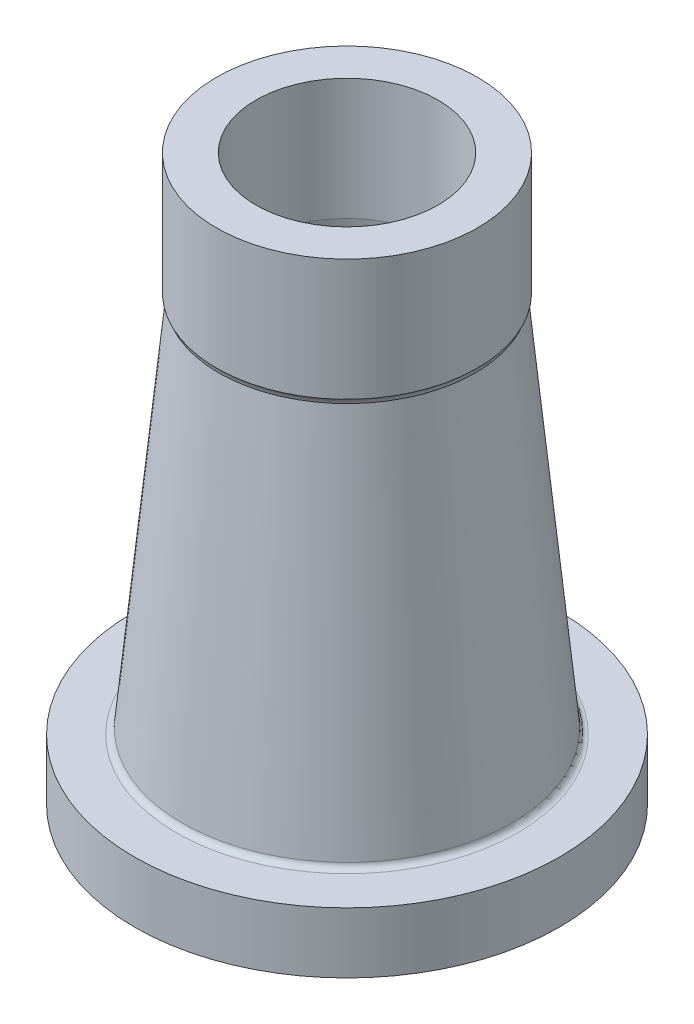
ISO-10303-21;
HEADER;
FILE_DESCRIPTION(('STEP AP214'),'2;1');
FILE_NAME('part.step','',(''),(''),'','','');
FILE_SCHEMA(('AUTOMOTIVE_DESIGN { 1 0 10303 214 1 1 1 1 }'));
ENDSEC;
DATA;
#1=APPLICATION_CONTEXT('core data for automotive mechanical design processes');
#2=APPLICATION_PROTOCOL_DEFINITION('international standard','automotive_design',2000,#1);
#3=PRODUCT_CONTEXT('',#1,'mechanical');
#4=PRODUCT('Part','Part','',(#3));
#5=PRODUCT_RELATED_PRODUCT_CATEGORY('part','',(#4));
#6=PRODUCT_DEFINITION_FORMATION('','',#4);
#7=PRODUCT_DEFINITION_CONTEXT('part definition',#1,'design');
#8=PRODUCT_DEFINITION('design','',#6,#7);
#9=PRODUCT_DEFINITION_SHAPE('','',#8);
#10=(LENGTH_UNIT() NAMED_UNIT(*) SI_UNIT(.MILLI.,.METRE.));
#11=(NAMED_UNIT(*) PLANE_ANGLE_UNIT() SI_UNIT($,.RADIAN.));
#12=(NAMED_UNIT(*) SI_UNIT($,.STERADIAN.) SOLID_ANGLE_UNIT());
#13=UNCERTAINTY_MEASURE_WITH_UNIT(LENGTH_MEASURE(1.E-05),#10,'distance_accuracy_value','');
#14=(GEOMETRIC_REPRESENTATION_CONTEXT(3) GLOBAL_UNCERTAINTY_ASSIGNED_CONTEXT((#13)) GLOBAL_UNIT_ASSIGNED_CONTEXT((#10,
#11,#12)) REPRESENTATION_CONTEXT('',''));
#15=CARTESIAN_POINT('',(0.,0.,0.));
#16=DIRECTION('',(0.,0.,1.));
#17=DIRECTION('',(1.,0.,0.));
#18=AXIS2_PLACEMENT_3D('',#15,#16,#17);
#19=CARTESIAN_POINT('',(0.,0.,0.));
#20=DIRECTION('',(0.,-1.,0.));
#21=DIRECTION('',(0.,0.,-1.));
#22=AXIS2_PLACEMENT_3D('',#19,#20,#21);
#23=CYLINDRICAL_SURFACE('',#22,30.);
#24=CARTESIAN_POINT('',(0.,146.,0.));
#25=DIRECTION('',(0.,-1.,0.));
#26=DIRECTION('',(0.,0.,-1.));
#27=AXIS2_PLACEMENT_3D('',#24,#25,#26);
#28=CIRCLE('',#27,30.);
#29=CARTESIAN_POINT('',(0.,146.,-30.));
#30=VERTEX_POINT('',#29);
#31=EDGE_CURVE('E10',#30,#30,#28,.T.);
#32=ORIENTED_EDGE('',*,*,#31,.T.);
#33=EDGE_LOOP('',(#32));
#34=FACE_BOUND('',#33,.T.);
#35=CARTESIAN_POINT('',(0.,186.,0.));
#36=DIRECTION('',(0.,-1.,0.));
#37=DIRECTION('',(0.,0.,-1.));
#38=AXIS2_PLACEMENT_3D('',#35,#36,#37);
#39=CIRCLE('',#38,30.);
#40=CARTESIAN_POINT('',(0.,186.,-30.));
#41=VERTEX_POINT('',#40);
#42=EDGE_CURVE('E78',#41,#41,#39,.T.);
#43=ORIENTED_EDGE('',*,*,#42,.F.);
#44=EDGE_LOOP('',(#43));
#45=FACE_BOUND('',#44,.T.);
#46=ADVANCED_FACE('F35',(#34,#45),#23,.F.);
#47=CARTESIAN_POINT('',(0.,146.,0.));
#48=DIRECTION('',(0.,-1.,0.));
#49=DIRECTION('',(0.,0.,-1.));
#50=AXIS2_PLACEMENT_3D('',#47,#48,#49);
#51=CONICAL_SURFACE('',#50,30.,0.0975910931533878);
#52=CARTESIAN_POINT('',(0.,3.,0.));
#53=DIRECTION('',(0.,-1.,0.));
#54=DIRECTION('',(0.,0.,-1.));
#55=AXIS2_PLACEMENT_3D('',#52,#53,#54);
#56=CIRCLE('',#55,44.);
#57=CARTESIAN_POINT('',(0.,3.,-44.));
#58=VERTEX_POINT('',#57);
#59=EDGE_CURVE('E41',#58,#58,#56,.T.);
#60=ORIENTED_EDGE('',*,*,#59,.T.);
#61=EDGE_LOOP('',(#60));
#62=FACE_BOUND('',#61,.T.);
#63=ORIENTED_EDGE('',*,*,#31,.F.);
#64=EDGE_LOOP('',(#63));
#65=FACE_BOUND('',#64,.T.);
#66=ADVANCED_FACE('F86',(#62,#65),#51,.F.);
#67=CARTESIAN_POINT('',(47.8925359391083,3.,0.));
#68=DIRECTION('',(0.,-1.,0.));
#69=DIRECTION('',(0.,0.,-1.));
#70=AXIS2_PLACEMENT_3D('',#67,#68,#69);
#71=PLANE('',#70);
#72=CARTESIAN_POINT('',(0.,3.,0.));
#73=DIRECTION('',(0.,-1.,0.));
#74=DIRECTION('',(0.,0.,-1.));
#75=AXIS2_PLACEMENT_3D('',#72,#73,#74);
#76=CIRCLE('',#75,47.8925359391083);
#77=CARTESIAN_POINT('',(0.,3.,-47.8925359391083));
#78=VERTEX_POINT('',#77);
#79=EDGE_CURVE('E45',#78,#78,#76,.T.);
#80=ORIENTED_EDGE('',*,*,#79,.T.);
#81=EDGE_LOOP('',(#80));
#82=FACE_BOUND('',#81,.T.);
#83=ORIENTED_EDGE('',*,*,#59,.F.);
#84=EDGE_LOOP('',(#83));
#85=FACE_BOUND('',#84,.T.);
#86=ADVANCED_FACE('F90',(#82,#85),#71,.T.);
#87=CARTESIAN_POINT('',(0.,0.999999999999998,0.));
#88=DIRECTION('',(0.,-1.,0.));
#89=DIRECTION('',(0.,0.,-1.));
#90=AXIS2_PLACEMENT_3D('',#87,#88,#89);
#91=TOROIDAL_SURFACE('',#90,47.8925359391083,2.);
#92=CARTESIAN_POINT('',(0.,1.19487251392129,0.));
#93=DIRECTION('',(0.,-1.,0.));
#94=DIRECTION('',(0.,0.,-1.));
#95=AXIS2_PLACEMENT_3D('',#92,#93,#94);
#96=CIRCLE('',#95,49.8830194741616);
#97=CARTESIAN_POINT('',(0.,1.19487251392129,-49.8830194741616));
#98=VERTEX_POINT('',#97);
#99=EDGE_CURVE('E49',#98,#98,#96,.T.);
#100=ORIENTED_EDGE('',*,*,#99,.T.);
#101=EDGE_LOOP('',(#100));
#102=FACE_BOUND('',#101,.T.);
#103=ORIENTED_EDGE('',*,*,#79,.F.);
#104=EDGE_LOOP('',(#103));
#105=FACE_BOUND('',#104,.T.);
#106=ADVANCED_FACE('F94',(#102,#105),#91,.F.);
#107=CARTESIAN_POINT('',(0.,1.19487251392129,0.));
#108=DIRECTION('',(0.,-1.,0.));
#109=DIRECTION('',(0.,0.,-1.));
#110=AXIS2_PLACEMENT_3D('',#107,#108,#109);
#111=CONICAL_SURFACE('',#110,49.8830194741616,0.0975910931533844);
#112=CARTESIAN_POINT('',(0.,0.,0.));
#113=DIRECTION('',(0.,-1.,0.));
#114=DIRECTION('',(0.,0.,-1.));
#115=AXIS2_PLACEMENT_3D('',#112,#113,#114);
#116=CIRCLE('',#115,50.);
#117=CARTESIAN_POINT('',(0.,0.,-50.));
#118=VERTEX_POINT('',#117);
#119=EDGE_CURVE('E54',#118,#118,#116,.T.);
#120=ORIENTED_EDGE('',*,*,#119,.T.);
#121=EDGE_LOOP('',(#120));
#122=FACE_BOUND('',#121,.T.);
#123=ORIENTED_EDGE('',*,*,#99,.F.);
#124=EDGE_LOOP('',(#123));
#125=FACE_BOUND('',#124,.T.);
#126=ADVANCED_FACE('F101',(#122,#125),#111,.F.);
#127=CARTESIAN_POINT('',(70.,0.,0.));
#128=DIRECTION('',(0.,-1.,0.));
#129=DIRECTION('',(0.,0.,-1.));
#130=AXIS2_PLACEMENT_3D('',#127,#128,#129);
#131=PLANE('',#130);
#132=CARTESIAN_POINT('',(0.,0.,0.));
#133=DIRECTION('',(0.,-1.,0.));
#134=DIRECTION('',(0.,0.,-1.));
#135=AXIS2_PLACEMENT_3D('',#132,#133,#134);
#136=CIRCLE('',#135,70.);
#137=CARTESIAN_POINT('',(0.,0.,-70.));
#138=VERTEX_POINT('',#137);
#139=EDGE_CURVE('E57',#138,#138,#136,.T.);
#140=ORIENTED_EDGE('',*,*,#139,.T.);
#141=EDGE_LOOP('',(#140));
#142=FACE_BOUND('',#141,.T.);
#143=ORIENTED_EDGE('',*,*,#119,.F.);
#144=EDGE_LOOP('',(#143));
#145=FACE_BOUND('',#144,.T.);
#146=ADVANCED_FACE('F105',(#142,#145),#131,.T.);
#147=CARTESIAN_POINT('',(0.,0.,0.));
#148=DIRECTION('',(0.,-1.,0.));
#149=DIRECTION('',(0.,0.,-1.));
#150=AXIS2_PLACEMENT_3D('',#147,#148,#149);
#151=CYLINDRICAL_SURFACE('',#150,70.);
#152=CARTESIAN_POINT('',(0.,20.,0.));
#153=DIRECTION('',(0.,-1.,0.));
#154=DIRECTION('',(0.,0.,-1.));
#155=AXIS2_PLACEMENT_3D('',#152,#153,#154);
#156=CIRCLE('',#155,70.);
#157=CARTESIAN_POINT('',(0.,20.,-70.));
#158=VERTEX_POINT('',#157);
#159=EDGE_CURVE('E60',#158,#158,#156,.T.);
#160=ORIENTED_EDGE('',*,*,#159,.T.);
#161=EDGE_LOOP('',(#160));
#162=FACE_BOUND('',#161,.T.);
#163=ORIENTED_EDGE('',*,*,#139,.F.);
#164=EDGE_LOOP('',(#163));
#165=FACE_BOUND('',#164,.T.);
#166=ADVANCED_FACE('F109',(#162,#165),#151,.T.);
#167=CARTESIAN_POINT('',(56.2067938807872,20.,0.));
#168=DIRECTION('',(0.,1.,0.));
#169=DIRECTION('',(0.,0.,1.));
#170=AXIS2_PLACEMENT_3D('',#167,#168,#169);
#171=PLANE('',#170);
#172=CARTESIAN_POINT('',(0.,20.,0.));
#173=DIRECTION('',(0.,-1.,0.));
#174=DIRECTION('',(0.,0.,-1.));
#175=AXIS2_PLACEMENT_3D('',#172,#173,#174);
#176=CIRCLE('',#175,56.2067938807872);
#177=CARTESIAN_POINT('',(0.,20.,-56.2067938807872));
#178=VERTEX_POINT('',#177);
#179=EDGE_CURVE('E63',#178,#178,#176,.T.);
#180=ORIENTED_EDGE('',*,*,#179,.T.);
#181=EDGE_LOOP('',(#180));
#182=FACE_BOUND('',#181,.T.);
#183=ORIENTED_EDGE('',*,*,#159,.F.);
#184=EDGE_LOOP('',(#183));
#185=FACE_BOUND('',#184,.T.);
#186=ADVANCED_FACE('F113',(#182,#185),#171,.T.);
#187=CARTESIAN_POINT('',(0.,22.,0.));
#188=DIRECTION('',(0.,-1.,0.));
#189=DIRECTION('',(0.,0.,-1.));
#190=AXIS2_PLACEMENT_3D('',#187,#188,#189);
#191=TOROIDAL_SURFACE('',#190,56.2067938807872,2.);
#192=CARTESIAN_POINT('',(0.,21.8051274860787,0.));
#193=DIRECTION('',(0.,-1.,0.));
#194=DIRECTION('',(0.,0.,-1.));
#195=AXIS2_PLACEMENT_3D('',#192,#193,#194);
#196=CIRCLE('',#195,54.216310345734);
#197=CARTESIAN_POINT('',(0.,21.8051274860787,-54.216310345734));
#198=VERTEX_POINT('',#197);
#199=EDGE_CURVE('E66',#198,#198,#196,.T.);
#200=ORIENTED_EDGE('',*,*,#199,.T.);
#201=EDGE_LOOP('',(#200));
#202=FACE_BOUND('',#201,.T.);
#203=ORIENTED_EDGE('',*,*,#179,.F.);
#204=EDGE_LOOP('',(#203));
#205=FACE_BOUND('',#204,.T.);
#206=ADVANCED_FACE('F117',(#202,#205),#191,.F.);
#207=CARTESIAN_POINT('',(0.,21.8051274860787,0.));
#208=DIRECTION('',(0.,-1.,0.));
#209=DIRECTION('',(0.,0.,-1.));
#210=AXIS2_PLACEMENT_3D('',#207,#208,#209);
#211=CONICAL_SURFACE('',#210,54.216310345734,0.0975910931533879);
#212=CARTESIAN_POINT('',(0.,144.227548489764,0.));
#213=DIRECTION('',(0.,-1.,0.));
#214=DIRECTION('',(0.,0.,-1.));
#215=AXIS2_PLACEMENT_3D('',#212,#213,#214);
#216=CIRCLE('',#215,42.2308984992193);
#217=CARTESIAN_POINT('',(0.,144.227548489764,-42.2308984992193));
#218=VERTEX_POINT('',#217);
#219=EDGE_CURVE('E69',#218,#218,#216,.T.);
#220=ORIENTED_EDGE('',*,*,#219,.T.);
#221=EDGE_LOOP('',(#220));
#222=FACE_BOUND('',#221,.T.);
#223=ORIENTED_EDGE('',*,*,#199,.F.);
#224=EDGE_LOOP('',(#223));
#225=FACE_BOUND('',#224,.T.);
#226=ADVANCED_FACE('F121',(#222,#225),#211,.T.);
#227=CARTESIAN_POINT('',(0.,143.160976541673,0.));
#228=DIRECTION('',(0.,-1.,0.));
#229=DIRECTION('',(0.,0.,-1.));
#230=AXIS2_PLACEMENT_3D('',#227,#228,#229);
#231=TOROIDAL_SURFACE('',#230,47.115816541474,5.);
#232=CARTESIAN_POINT('',(0.,146.,0.));
#233=DIRECTION('',(0.,-1.,0.));
#234=DIRECTION('',(0.,0.,-1.));
#235=AXIS2_PLACEMENT_3D('',#232,#233,#234);
#236=CIRCLE('',#235,43.);
#237=CARTESIAN_POINT('',(0.,146.,-43.));
#238=VERTEX_POINT('',#237);
#239=EDGE_CURVE('E72',#238,#238,#236,.T.);
#240=ORIENTED_EDGE('',*,*,#239,.T.);
#241=EDGE_LOOP('',(#240));
#242=FACE_BOUND('',#241,.T.);
#243=ORIENTED_EDGE('',*,*,#219,.F.);
#244=EDGE_LOOP('',(#243));
#245=FACE_BOUND('',#244,.T.);
#246=ADVANCED_FACE('F125',(#242,#245),#231,.F.);
#247=CARTESIAN_POINT('',(0.,0.,0.));
#248=DIRECTION('',(0.,-1.,0.));
#249=DIRECTION('',(0.,0.,-1.));
#250=AXIS2_PLACEMENT_3D('',#247,#248,#249);
#251=CYLINDRICAL_SURFACE('',#250,43.);
#252=CARTESIAN_POINT('',(0.,186.,0.));
#253=DIRECTION('',(0.,-1.,0.));
#254=DIRECTION('',(0.,0.,-1.));
#255=AXIS2_PLACEMENT_3D('',#252,#253,#254);
#256=CIRCLE('',#255,43.);
#257=CARTESIAN_POINT('',(0.,186.,-43.));
#258=VERTEX_POINT('',#257);
#259=EDGE_CURVE('E75',#258,#258,#256,.T.);
#260=ORIENTED_EDGE('',*,*,#259,.T.);
#261=EDGE_LOOP('',(#260));
#262=FACE_BOUND('',#261,.T.);
#263=ORIENTED_EDGE('',*,*,#239,.F.);
#264=EDGE_LOOP('',(#263));
#265=FACE_BOUND('',#264,.T.);
#266=ADVANCED_FACE('F129',(#262,#265),#251,.T.);
#267=CARTESIAN_POINT('',(30.,186.,0.));
#268=DIRECTION('',(0.,1.,0.));
#269=DIRECTION('',(0.,0.,1.));
#270=AXIS2_PLACEMENT_3D('',#267,#268,#269);
#271=PLANE('',#270);
#272=ORIENTED_EDGE('',*,*,#42,.T.);
#273=EDGE_LOOP('',(#272));
#274=FACE_BOUND('',#273,.T.);
#275=ORIENTED_EDGE('',*,*,#259,.F.);
#276=EDGE_LOOP('',(#275));
#277=FACE_BOUND('',#276,.T.);
#278=ADVANCED_FACE('F82',(#274,#277),#271,.T.);
#279=CLOSED_SHELL('',(#46,#66,#86,#106,#126,#146,#166,#186,#206,#226,#246,#266,#278));
#280=MANIFOLD_SOLID_BREP('B2',#279);
#281=ADVANCED_BREP_SHAPE_REPRESENTATION('',(#18,#280),#14);
#282=SHAPE_DEFINITION_REPRESENTATION(#9,#281);
ENDSEC;
END-ISO-10303-21;
